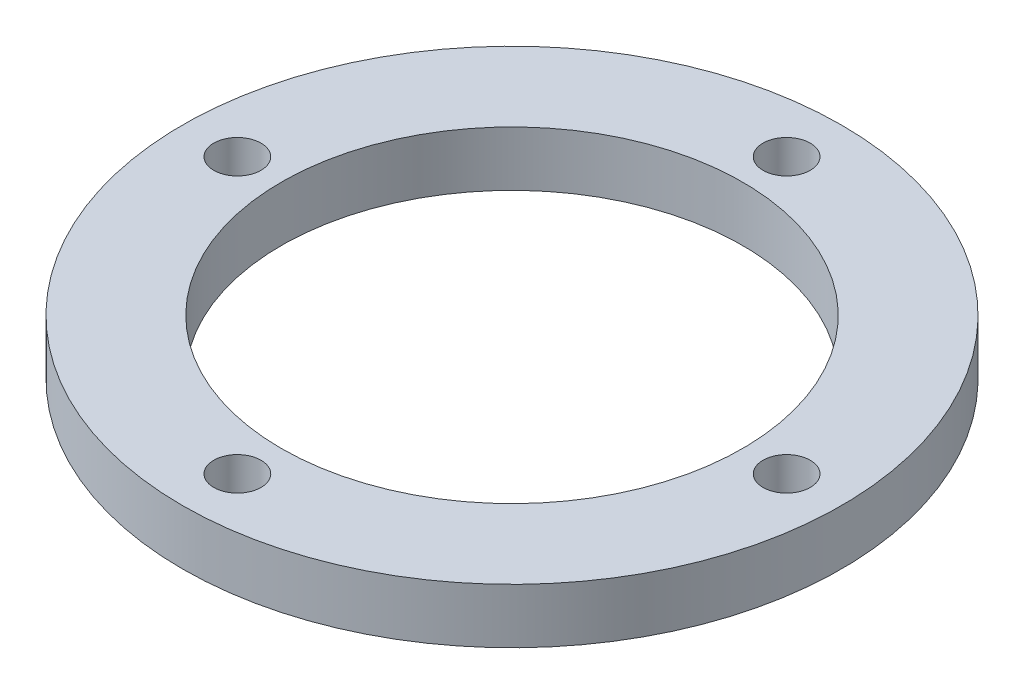
ISO-10303-21;
HEADER;
FILE_DESCRIPTION(('STEP AP214'),'2;1');
FILE_NAME('part.step','',(''),(''),'','','');
FILE_SCHEMA(('AUTOMOTIVE_DESIGN { 1 0 10303 214 1 1 1 1 }'));
ENDSEC;
DATA;
#1=APPLICATION_CONTEXT('core data for automotive mechanical design processes');
#2=APPLICATION_PROTOCOL_DEFINITION('international standard','automotive_design',2000,#1);
#3=PRODUCT_CONTEXT('',#1,'mechanical');
#4=PRODUCT('Part','Part','',(#3));
#5=PRODUCT_RELATED_PRODUCT_CATEGORY('part','',(#4));
#6=PRODUCT_DEFINITION_FORMATION('','',#4);
#7=PRODUCT_DEFINITION_CONTEXT('part definition',#1,'design');
#8=PRODUCT_DEFINITION('design','',#6,#7);
#9=PRODUCT_DEFINITION_SHAPE('','',#8);
#10=(LENGTH_UNIT() NAMED_UNIT(*) SI_UNIT(.MILLI.,.METRE.));
#11=(NAMED_UNIT(*) PLANE_ANGLE_UNIT() SI_UNIT($,.RADIAN.));
#12=(NAMED_UNIT(*) SI_UNIT($,.STERADIAN.) SOLID_ANGLE_UNIT());
#13=UNCERTAINTY_MEASURE_WITH_UNIT(LENGTH_MEASURE(1.E-05),#10,'distance_accuracy_value','');
#14=(GEOMETRIC_REPRESENTATION_CONTEXT(3) GLOBAL_UNCERTAINTY_ASSIGNED_CONTEXT((#13)) GLOBAL_UNIT_ASSIGNED_CONTEXT((#10,
#11,#12)) REPRESENTATION_CONTEXT('',''));
#15=CARTESIAN_POINT('',(0.,0.,0.));
#16=DIRECTION('',(0.,0.,1.));
#17=DIRECTION('',(1.,0.,0.));
#18=AXIS2_PLACEMENT_3D('',#15,#16,#17);
#19=CARTESIAN_POINT('',(0.,5.,0.));
#20=DIRECTION('',(0.,1.,0.));
#21=DIRECTION('',(0.,0.,1.));
#22=AXIS2_PLACEMENT_3D('',#19,#20,#21);
#23=PLANE('',#22);
#24=CARTESIAN_POINT('',(0.,5.,25.));
#25=DIRECTION('',(0.,1.,0.));
#26=DIRECTION('',(0.,0.,1.));
#27=AXIS2_PLACEMENT_3D('',#24,#25,#26);
#28=CIRCLE('',#27,2.15);
#29=CARTESIAN_POINT('',(0.,5.,27.15));
#30=VERTEX_POINT('',#29);
#31=EDGE_CURVE('E70',#30,#30,#28,.T.);
#32=ORIENTED_EDGE('',*,*,#31,.F.);
#33=EDGE_LOOP('',(#32));
#34=FACE_BOUND('',#33,.T.);
#35=CARTESIAN_POINT('',(0.,5.,-25.));
#36=DIRECTION('',(0.,1.,0.));
#37=DIRECTION('',(0.,0.,1.));
#38=AXIS2_PLACEMENT_3D('',#35,#36,#37);
#39=CIRCLE('',#38,2.15);
#40=CARTESIAN_POINT('',(0.,5.,-22.85));
#41=VERTEX_POINT('',#40);
#42=EDGE_CURVE('E64',#41,#41,#39,.T.);
#43=ORIENTED_EDGE('',*,*,#42,.F.);
#44=EDGE_LOOP('',(#43));
#45=FACE_BOUND('',#44,.T.);
#46=CARTESIAN_POINT('',(25.,5.,0.));
#47=DIRECTION('',(0.,1.,0.));
#48=DIRECTION('',(0.,0.,1.));
#49=AXIS2_PLACEMENT_3D('',#46,#47,#48);
#50=CIRCLE('',#49,2.15);
#51=CARTESIAN_POINT('',(25.,5.,2.15));
#52=VERTEX_POINT('',#51);
#53=EDGE_CURVE('E58',#52,#52,#50,.T.);
#54=ORIENTED_EDGE('',*,*,#53,.F.);
#55=EDGE_LOOP('',(#54));
#56=FACE_BOUND('',#55,.T.);
#57=CARTESIAN_POINT('',(-25.,5.,0.));
#58=DIRECTION('',(0.,1.,0.));
#59=DIRECTION('',(0.,0.,1.));
#60=AXIS2_PLACEMENT_3D('',#57,#58,#59);
#61=CIRCLE('',#60,2.15);
#62=CARTESIAN_POINT('',(-25.,5.,2.15));
#63=VERTEX_POINT('',#62);
#64=EDGE_CURVE('E52',#63,#63,#61,.T.);
#65=ORIENTED_EDGE('',*,*,#64,.F.);
#66=EDGE_LOOP('',(#65));
#67=FACE_BOUND('',#66,.T.);
#68=CARTESIAN_POINT('',(0.,5.,0.));
#69=DIRECTION('',(0.,1.,0.));
#70=DIRECTION('',(0.,0.,1.));
#71=AXIS2_PLACEMENT_3D('',#68,#69,#70);
#72=CIRCLE('',#71,30.);
#73=CARTESIAN_POINT('',(0.,5.,30.));
#74=VERTEX_POINT('',#73);
#75=EDGE_CURVE('E10',#74,#74,#72,.T.);
#76=ORIENTED_EDGE('',*,*,#75,.T.);
#77=EDGE_LOOP('',(#76));
#78=FACE_BOUND('',#77,.T.);
#79=CARTESIAN_POINT('',(0.,5.,0.));
#80=DIRECTION('',(0.,1.,0.));
#81=DIRECTION('',(0.,0.,1.));
#82=AXIS2_PLACEMENT_3D('',#79,#80,#81);
#83=CIRCLE('',#82,21.);
#84=CARTESIAN_POINT('',(0.,5.,21.));
#85=VERTEX_POINT('',#84);
#86=EDGE_CURVE('E42',#85,#85,#83,.T.);
#87=ORIENTED_EDGE('',*,*,#86,.F.);
#88=EDGE_LOOP('',(#87));
#89=FACE_BOUND('',#88,.T.);
#90=ADVANCED_FACE('F31',(#34,#45,#56,#67,#78,#89),#23,.T.);
#91=CARTESIAN_POINT('',(0.,0.,0.));
#92=DIRECTION('',(0.,1.,0.));
#93=DIRECTION('',(0.,0.,1.));
#94=AXIS2_PLACEMENT_3D('',#91,#92,#93);
#95=PLANE('',#94);
#96=CARTESIAN_POINT('',(0.,0.,25.));
#97=DIRECTION('',(0.,1.,0.));
#98=DIRECTION('',(0.,0.,1.));
#99=AXIS2_PLACEMENT_3D('',#96,#97,#98);
#100=CIRCLE('',#99,2.15);
#101=CARTESIAN_POINT('',(0.,0.,27.15));
#102=VERTEX_POINT('',#101);
#103=EDGE_CURVE('E67',#102,#102,#100,.T.);
#104=ORIENTED_EDGE('',*,*,#103,.T.);
#105=EDGE_LOOP('',(#104));
#106=FACE_BOUND('',#105,.T.);
#107=CARTESIAN_POINT('',(0.,0.,-25.));
#108=DIRECTION('',(0.,1.,0.));
#109=DIRECTION('',(0.,0.,1.));
#110=AXIS2_PLACEMENT_3D('',#107,#108,#109);
#111=CIRCLE('',#110,2.15);
#112=CARTESIAN_POINT('',(0.,0.,-22.85));
#113=VERTEX_POINT('',#112);
#114=EDGE_CURVE('E61',#113,#113,#111,.T.);
#115=ORIENTED_EDGE('',*,*,#114,.T.);
#116=EDGE_LOOP('',(#115));
#117=FACE_BOUND('',#116,.T.);
#118=CARTESIAN_POINT('',(25.,0.,0.));
#119=DIRECTION('',(0.,1.,0.));
#120=DIRECTION('',(0.,0.,1.));
#121=AXIS2_PLACEMENT_3D('',#118,#119,#120);
#122=CIRCLE('',#121,2.15);
#123=CARTESIAN_POINT('',(25.,0.,2.15));
#124=VERTEX_POINT('',#123);
#125=EDGE_CURVE('E55',#124,#124,#122,.T.);
#126=ORIENTED_EDGE('',*,*,#125,.T.);
#127=EDGE_LOOP('',(#126));
#128=FACE_BOUND('',#127,.T.);
#129=CARTESIAN_POINT('',(-25.,0.,0.));
#130=DIRECTION('',(0.,1.,0.));
#131=DIRECTION('',(0.,0.,1.));
#132=AXIS2_PLACEMENT_3D('',#129,#130,#131);
#133=CIRCLE('',#132,2.15);
#134=CARTESIAN_POINT('',(-25.,0.,2.15));
#135=VERTEX_POINT('',#134);
#136=EDGE_CURVE('E47',#135,#135,#133,.T.);
#137=ORIENTED_EDGE('',*,*,#136,.T.);
#138=EDGE_LOOP('',(#137));
#139=FACE_BOUND('',#138,.T.);
#140=CARTESIAN_POINT('',(0.,0.,0.));
#141=DIRECTION('',(0.,1.,0.));
#142=DIRECTION('',(0.,0.,1.));
#143=AXIS2_PLACEMENT_3D('',#140,#141,#142);
#144=CIRCLE('',#143,30.);
#145=CARTESIAN_POINT('',(0.,0.,30.));
#146=VERTEX_POINT('',#145);
#147=EDGE_CURVE('E35',#146,#146,#144,.T.);
#148=ORIENTED_EDGE('',*,*,#147,.F.);
#149=EDGE_LOOP('',(#148));
#150=FACE_BOUND('',#149,.T.);
#151=CARTESIAN_POINT('',(0.,0.,0.));
#152=DIRECTION('',(0.,1.,0.));
#153=DIRECTION('',(0.,0.,1.));
#154=AXIS2_PLACEMENT_3D('',#151,#152,#153);
#155=CIRCLE('',#154,21.);
#156=CARTESIAN_POINT('',(0.,0.,21.));
#157=VERTEX_POINT('',#156);
#158=EDGE_CURVE('E44',#157,#157,#155,.T.);
#159=ORIENTED_EDGE('',*,*,#158,.T.);
#160=EDGE_LOOP('',(#159));
#161=FACE_BOUND('',#160,.T.);
#162=ADVANCED_FACE('F78',(#106,#117,#128,#139,#150,#161),#95,.F.);
#163=CARTESIAN_POINT('',(0.,5.,0.));
#164=DIRECTION('',(0.,-1.,0.));
#165=DIRECTION('',(0.,0.,-1.));
#166=AXIS2_PLACEMENT_3D('',#163,#164,#165);
#167=CYLINDRICAL_SURFACE('',#166,30.);
#168=ORIENTED_EDGE('',*,*,#75,.F.);
#169=EDGE_LOOP('',(#168));
#170=FACE_BOUND('',#169,.T.);
#171=ORIENTED_EDGE('',*,*,#147,.T.);
#172=EDGE_LOOP('',(#171));
#173=FACE_BOUND('',#172,.T.);
#174=ADVANCED_FACE('F33',(#170,#173),#167,.T.);
#175=CARTESIAN_POINT('',(0.,5.,0.));
#176=DIRECTION('',(0.,-1.,0.));
#177=DIRECTION('',(0.,0.,-1.));
#178=AXIS2_PLACEMENT_3D('',#175,#176,#177);
#179=CYLINDRICAL_SURFACE('',#178,21.);
#180=ORIENTED_EDGE('',*,*,#86,.T.);
#181=EDGE_LOOP('',(#180));
#182=FACE_BOUND('',#181,.T.);
#183=ORIENTED_EDGE('',*,*,#158,.F.);
#184=EDGE_LOOP('',(#183));
#185=FACE_BOUND('',#184,.T.);
#186=ADVANCED_FACE('F88',(#182,#185),#179,.F.);
#187=CARTESIAN_POINT('',(-25.,5.,0.));
#188=DIRECTION('',(0.,1.,0.));
#189=DIRECTION('',(0.,0.,1.));
#190=AXIS2_PLACEMENT_3D('',#187,#188,#189);
#191=CYLINDRICAL_SURFACE('',#190,2.15);
#192=ORIENTED_EDGE('',*,*,#136,.F.);
#193=EDGE_LOOP('',(#192));
#194=FACE_BOUND('',#193,.T.);
#195=ORIENTED_EDGE('',*,*,#64,.T.);
#196=EDGE_LOOP('',(#195));
#197=FACE_BOUND('',#196,.T.);
#198=ADVANCED_FACE('F91',(#194,#197),#191,.F.);
#199=CARTESIAN_POINT('',(25.,5.,0.));
#200=DIRECTION('',(0.,1.,0.));
#201=DIRECTION('',(0.,0.,1.));
#202=AXIS2_PLACEMENT_3D('',#199,#200,#201);
#203=CYLINDRICAL_SURFACE('',#202,2.15);
#204=ORIENTED_EDGE('',*,*,#125,.F.);
#205=EDGE_LOOP('',(#204));
#206=FACE_BOUND('',#205,.T.);
#207=ORIENTED_EDGE('',*,*,#53,.T.);
#208=EDGE_LOOP('',(#207));
#209=FACE_BOUND('',#208,.T.);
#210=ADVANCED_FACE('F105',(#206,#209),#203,.F.);
#211=CARTESIAN_POINT('',(0.,5.,-25.));
#212=DIRECTION('',(0.,1.,0.));
#213=DIRECTION('',(0.,0.,1.));
#214=AXIS2_PLACEMENT_3D('',#211,#212,#213);
#215=CYLINDRICAL_SURFACE('',#214,2.15);
#216=ORIENTED_EDGE('',*,*,#114,.F.);
#217=EDGE_LOOP('',(#216));
#218=FACE_BOUND('',#217,.T.);
#219=ORIENTED_EDGE('',*,*,#42,.T.);
#220=EDGE_LOOP('',(#219));
#221=FACE_BOUND('',#220,.T.);
#222=ADVANCED_FACE('F109',(#218,#221),#215,.F.);
#223=CARTESIAN_POINT('',(0.,5.,25.));
#224=DIRECTION('',(0.,1.,0.));
#225=DIRECTION('',(0.,0.,1.));
#226=AXIS2_PLACEMENT_3D('',#223,#224,#225);
#227=CYLINDRICAL_SURFACE('',#226,2.15);
#228=ORIENTED_EDGE('',*,*,#103,.F.);
#229=EDGE_LOOP('',(#228));
#230=FACE_BOUND('',#229,.T.);
#231=ORIENTED_EDGE('',*,*,#31,.T.);
#232=EDGE_LOOP('',(#231));
#233=FACE_BOUND('',#232,.T.);
#234=ADVANCED_FACE('F74',(#230,#233),#227,.F.);
#235=CLOSED_SHELL('',(#90,#162,#174,#186,#198,#210,#222,#234));
#236=MANIFOLD_SOLID_BREP('B2',#235);
#237=ADVANCED_BREP_SHAPE_REPRESENTATION('',(#18,#236),#14);
#238=SHAPE_DEFINITION_REPRESENTATION(#9,#237);
ENDSEC;
END-ISO-10303-21;
